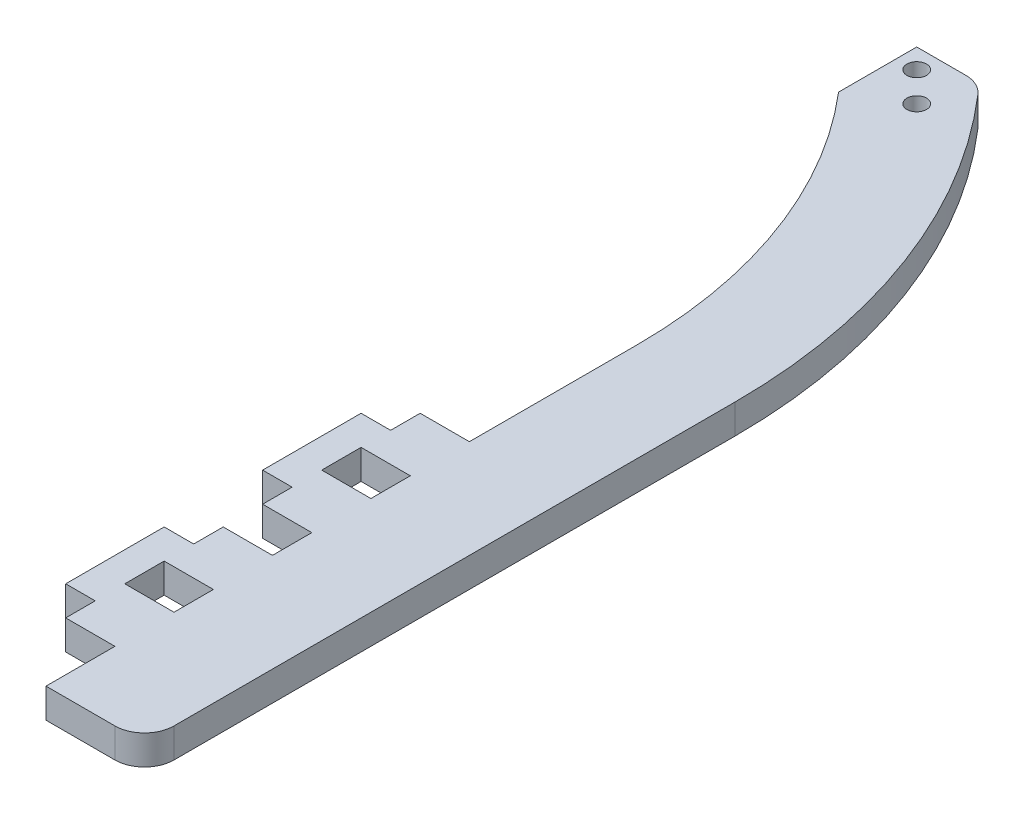
ISO-10303-21;
HEADER;
FILE_DESCRIPTION(('STEP AP214'),'2;1');
FILE_NAME('part.step','',(''),(''),'','','');
FILE_SCHEMA(('AUTOMOTIVE_DESIGN { 1 0 10303 214 1 1 1 1 }'));
ENDSEC;
DATA;
#1=APPLICATION_CONTEXT('core data for automotive mechanical design processes');
#2=APPLICATION_PROTOCOL_DEFINITION('international standard','automotive_design',2000,#1);
#3=PRODUCT_CONTEXT('',#1,'mechanical');
#4=PRODUCT('Part','Part','',(#3));
#5=PRODUCT_RELATED_PRODUCT_CATEGORY('part','',(#4));
#6=PRODUCT_DEFINITION_FORMATION('','',#4);
#7=PRODUCT_DEFINITION_CONTEXT('part definition',#1,'design');
#8=PRODUCT_DEFINITION('design','',#6,#7);
#9=PRODUCT_DEFINITION_SHAPE('','',#8);
#10=(LENGTH_UNIT() NAMED_UNIT(*) SI_UNIT(.MILLI.,.METRE.));
#11=(NAMED_UNIT(*) PLANE_ANGLE_UNIT() SI_UNIT($,.RADIAN.));
#12=(NAMED_UNIT(*) SI_UNIT($,.STERADIAN.) SOLID_ANGLE_UNIT());
#13=UNCERTAINTY_MEASURE_WITH_UNIT(LENGTH_MEASURE(1.E-05),#10,'distance_accuracy_value','');
#14=(GEOMETRIC_REPRESENTATION_CONTEXT(3) GLOBAL_UNCERTAINTY_ASSIGNED_CONTEXT((#13)) GLOBAL_UNIT_ASSIGNED_CONTEXT((#10,
#11,#12)) REPRESENTATION_CONTEXT('',''));
#15=CARTESIAN_POINT('',(0.,0.,0.));
#16=DIRECTION('',(0.,0.,1.));
#17=DIRECTION('',(1.,0.,0.));
#18=AXIS2_PLACEMENT_3D('',#15,#16,#17);
#19=CARTESIAN_POINT('',(-5.66950299421733,-0.01,-40.4327470649756));
#20=DIRECTION('',(0.,0.,1.));
#21=DIRECTION('',(1.,0.,0.));
#22=AXIS2_PLACEMENT_3D('',#19,#20,#21);
#23=PLANE('',#22);
#24=DIRECTION('',(1.,0.,0.));
#25=VECTOR('',#24,1.);
#26=CARTESIAN_POINT('',(0.,3.,-40.4327470649756));
#27=LINE('',#26,#25);
#28=CARTESIAN_POINT('',(-12.,3.,-40.4327470649756));
#29=VERTEX_POINT('',#28);
#30=CARTESIAN_POINT('',(-7.01407850040248,3.,-40.4327470649756));
#31=VERTEX_POINT('',#30);
#32=EDGE_CURVE('E486',#29,#31,#27,.T.);
#33=ORIENTED_EDGE('',*,*,#32,.T.);
#34=DIRECTION('',(0.,-1.,0.));
#35=VECTOR('',#34,1.);
#36=CARTESIAN_POINT('',(-7.01407850040248,-0.01,-40.4327470649756));
#37=LINE('',#36,#35);
#38=CARTESIAN_POINT('',(-7.01407850040248,0.,-40.4327470649756));
#39=VERTEX_POINT('',#38);
#40=EDGE_CURVE('E498',#31,#39,#37,.T.);
#41=ORIENTED_EDGE('',*,*,#40,.T.);
#42=DIRECTION('',(1.,0.,0.));
#43=VECTOR('',#42,1.);
#44=CARTESIAN_POINT('',(0.,0.,-40.4327470649756));
#45=LINE('',#44,#43);
#46=CARTESIAN_POINT('',(-12.,0.,-40.4327470649756));
#47=VERTEX_POINT('',#46);
#48=EDGE_CURVE('E485',#47,#39,#45,.T.);
#49=ORIENTED_EDGE('',*,*,#48,.F.);
#50=DIRECTION('',(0.,-1.,0.));
#51=VECTOR('',#50,1.);
#52=CARTESIAN_POINT('',(-12.,-0.01,-40.4327470649756));
#53=LINE('',#52,#51);
#54=EDGE_CURVE('E490',#29,#47,#53,.T.);
#55=ORIENTED_EDGE('',*,*,#54,.F.);
#56=EDGE_LOOP('',(#33,#41,#49,#55));
#57=FACE_BOUND('',#56,.T.);
#58=ADVANCED_FACE('F36',(#57),#23,.F.);
#59=CARTESIAN_POINT('',(0.,3.,0.));
#60=DIRECTION('',(1.,0.,0.));
#61=DIRECTION('',(0.,0.,-1.));
#62=AXIS2_PLACEMENT_3D('',#59,#60,#61);
#63=PLANE('',#62);
#64=DIRECTION('',(0.,0.,1.));
#65=VECTOR('',#64,1.);
#66=CARTESIAN_POINT('',(0.,0.,0.));
#67=LINE('',#66,#65);
#68=CARTESIAN_POINT('',(0.,0.,0.));
#69=VERTEX_POINT('',#68);
#70=CARTESIAN_POINT('',(0.,0.,17.));
#71=VERTEX_POINT('',#70);
#72=EDGE_CURVE('E448',#69,#71,#67,.T.);
#73=ORIENTED_EDGE('',*,*,#72,.T.);
#74=DIRECTION('',(0.,1.,0.));
#75=VECTOR('',#74,1.);
#76=CARTESIAN_POINT('',(0.,3.,17.));
#77=LINE('',#76,#75);
#78=CARTESIAN_POINT('',(0.,3.,17.));
#79=VERTEX_POINT('',#78);
#80=EDGE_CURVE('E342',#71,#79,#77,.T.);
#81=ORIENTED_EDGE('',*,*,#80,.T.);
#82=DIRECTION('',(0.,0.,1.));
#83=VECTOR('',#82,1.);
#84=CARTESIAN_POINT('',(0.,3.,0.));
#85=LINE('',#84,#83);
#86=CARTESIAN_POINT('',(0.,3.,0.));
#87=VERTEX_POINT('',#86);
#88=EDGE_CURVE('E432',#87,#79,#85,.T.);
#89=ORIENTED_EDGE('',*,*,#88,.F.);
#90=DIRECTION('',(0.,-1.,0.));
#91=VECTOR('',#90,1.);
#92=CARTESIAN_POINT('',(0.,3.,0.));
#93=LINE('',#92,#91);
#94=EDGE_CURVE('E467',#87,#69,#93,.T.);
#95=ORIENTED_EDGE('',*,*,#94,.T.);
#96=EDGE_LOOP('',(#73,#81,#89,#95));
#97=FACE_BOUND('',#96,.T.);
#98=ADVANCED_FACE('F546',(#97),#63,.F.);
#99=CARTESIAN_POINT('',(0.,3.,53.));
#100=VERTEX_POINT('',#99);
#101=CARTESIAN_POINT('',(0.,3.,60.));
#102=VERTEX_POINT('',#101);
#103=EDGE_CURVE('E430',#100,#102,#85,.T.);
#104=ORIENTED_EDGE('',*,*,#103,.F.);
#105=DIRECTION('',(0.,-1.,0.));
#106=VECTOR('',#105,1.);
#107=CARTESIAN_POINT('',(0.,3.,53.));
#108=LINE('',#107,#106);
#109=CARTESIAN_POINT('',(0.,0.,53.));
#110=VERTEX_POINT('',#109);
#111=EDGE_CURVE('E357',#100,#110,#108,.T.);
#112=ORIENTED_EDGE('',*,*,#111,.T.);
#113=CARTESIAN_POINT('',(0.,0.,60.));
#114=VERTEX_POINT('',#113);
#115=EDGE_CURVE('E447',#110,#114,#67,.T.);
#116=ORIENTED_EDGE('',*,*,#115,.T.);
#117=DIRECTION('',(0.,-1.,0.));
#118=VECTOR('',#117,1.);
#119=CARTESIAN_POINT('',(0.,3.,60.));
#120=LINE('',#119,#118);
#121=EDGE_CURVE('E461',#102,#114,#120,.T.);
#122=ORIENTED_EDGE('',*,*,#121,.F.);
#123=EDGE_LOOP('',(#104,#112,#116,#122));
#124=FACE_BOUND('',#123,.T.);
#125=ADVANCED_FACE('F585',(#124),#63,.F.);
#126=CARTESIAN_POINT('',(-12.,-0.01,-32.4961536185439));
#127=DIRECTION('',(1.,0.,0.));
#128=DIRECTION('',(0.,0.,-1.));
#129=AXIS2_PLACEMENT_3D('',#126,#127,#128);
#130=PLANE('',#129);
#131=DIRECTION('',(0.,0.,-1.));
#132=VECTOR('',#131,1.);
#133=CARTESIAN_POINT('',(-12.,3.,0.));
#134=LINE('',#133,#132);
#135=CARTESIAN_POINT('',(-12.,3.,-32.4961536185439));
#136=VERTEX_POINT('',#135);
#137=EDGE_CURVE('E468',#136,#29,#134,.T.);
#138=ORIENTED_EDGE('',*,*,#137,.T.);
#139=ORIENTED_EDGE('',*,*,#54,.T.);
#140=DIRECTION('',(0.,0.,-1.));
#141=VECTOR('',#140,1.);
#142=CARTESIAN_POINT('',(-12.,0.,0.));
#143=LINE('',#142,#141);
#144=CARTESIAN_POINT('',(-12.,0.,-32.4961536185439));
#145=VERTEX_POINT('',#144);
#146=EDGE_CURVE('E464',#145,#47,#143,.T.);
#147=ORIENTED_EDGE('',*,*,#146,.F.);
#148=DIRECTION('',(0.,-1.,0.));
#149=VECTOR('',#148,1.);
#150=CARTESIAN_POINT('',(-12.,3.,-32.4961536185439));
#151=LINE('',#150,#149);
#152=EDGE_CURVE('E472',#145,#136,#151,.F.);
#153=ORIENTED_EDGE('',*,*,#152,.T.);
#154=EDGE_LOOP('',(#138,#139,#147,#153));
#155=FACE_BOUND('',#154,.T.);
#156=ADVANCED_FACE('F557',(#155),#130,.F.);
#157=CARTESIAN_POINT('',(0.,3.,60.));
#158=DIRECTION('',(0.,0.,-1.));
#159=DIRECTION('',(-1.,0.,0.));
#160=AXIS2_PLACEMENT_3D('',#157,#158,#159);
#161=PLANE('',#160);
#162=DIRECTION('',(1.,0.,0.));
#163=VECTOR('',#162,1.);
#164=CARTESIAN_POINT('',(0.,0.,60.));
#165=LINE('',#164,#163);
#166=CARTESIAN_POINT('',(7.00000000000001,0.,60.));
#167=VERTEX_POINT('',#166);
#168=EDGE_CURVE('E451',#114,#167,#165,.T.);
#169=ORIENTED_EDGE('',*,*,#168,.T.);
#170=DIRECTION('',(0.,-1.,0.));
#171=VECTOR('',#170,1.);
#172=CARTESIAN_POINT('',(7.00000000000001,3.,60.));
#173=LINE('',#172,#171);
#174=CARTESIAN_POINT('',(7.00000000000001,3.,60.));
#175=VERTEX_POINT('',#174);
#176=EDGE_CURVE('E481',#167,#175,#173,.F.);
#177=ORIENTED_EDGE('',*,*,#176,.T.);
#178=DIRECTION('',(1.,0.,0.));
#179=VECTOR('',#178,1.);
#180=CARTESIAN_POINT('',(0.,3.,60.));
#181=LINE('',#180,#179);
#182=EDGE_CURVE('E435',#102,#175,#181,.T.);
#183=ORIENTED_EDGE('',*,*,#182,.F.);
#184=ORIENTED_EDGE('',*,*,#121,.T.);
#185=EDGE_LOOP('',(#169,#177,#183,#184));
#186=FACE_BOUND('',#185,.T.);
#187=ADVANCED_FACE('F577',(#186),#161,.F.);
#188=CARTESIAN_POINT('',(10.,3.,0.));
#189=DIRECTION('',(-1.,0.,0.));
#190=DIRECTION('',(0.,0.,1.));
#191=AXIS2_PLACEMENT_3D('',#188,#189,#190);
#192=PLANE('',#191);
#193=DIRECTION('',(0.,0.,-1.));
#194=VECTOR('',#193,1.);
#195=CARTESIAN_POINT('',(10.,3.,0.));
#196=LINE('',#195,#194);
#197=CARTESIAN_POINT('',(10.,3.,57.));
#198=VERTEX_POINT('',#197);
#199=CARTESIAN_POINT('',(10.,3.,0.));
#200=VERTEX_POINT('',#199);
#201=EDGE_CURVE('E439',#198,#200,#196,.T.);
#202=ORIENTED_EDGE('',*,*,#201,.F.);
#203=DIRECTION('',(0.,-1.,0.));
#204=VECTOR('',#203,1.);
#205=CARTESIAN_POINT('',(10.,3.,57.));
#206=LINE('',#205,#204);
#207=CARTESIAN_POINT('',(10.,0.,57.));
#208=VERTEX_POINT('',#207);
#209=EDGE_CURVE('E471',#198,#208,#206,.T.);
#210=ORIENTED_EDGE('',*,*,#209,.T.);
#211=DIRECTION('',(0.,0.,-1.));
#212=VECTOR('',#211,1.);
#213=CARTESIAN_POINT('',(10.,0.,0.));
#214=LINE('',#213,#212);
#215=CARTESIAN_POINT('',(10.,0.,0.));
#216=VERTEX_POINT('',#215);
#217=EDGE_CURVE('E455',#208,#216,#214,.T.);
#218=ORIENTED_EDGE('',*,*,#217,.T.);
#219=DIRECTION('',(0.,-1.,0.));
#220=VECTOR('',#219,1.);
#221=CARTESIAN_POINT('',(10.,3.,0.));
#222=LINE('',#221,#220);
#223=EDGE_CURVE('E444',#200,#216,#222,.T.);
#224=ORIENTED_EDGE('',*,*,#223,.F.);
#225=EDGE_LOOP('',(#202,#210,#218,#224));
#226=FACE_BOUND('',#225,.T.);
#227=ADVANCED_FACE('F570',(#226),#192,.F.);
#228=CARTESIAN_POINT('',(-50.,3.,0.));
#229=DIRECTION('',(0.,-1.,0.));
#230=DIRECTION('',(0.,0.,-1.));
#231=AXIS2_PLACEMENT_3D('',#228,#229,#230);
#232=CYLINDRICAL_SURFACE('',#231,60.);
#233=CARTESIAN_POINT('',(-50.,0.,0.));
#234=DIRECTION('',(0.,1.,0.));
#235=DIRECTION('',(0.,0.,1.));
#236=AXIS2_PLACEMENT_3D('',#233,#234,#235);
#237=CIRCLE('',#236,60.);
#238=CARTESIAN_POINT('',(-4.75166157937103,0.,-39.4028916473427));
#239=VERTEX_POINT('',#238);
#240=EDGE_CURVE('E424',#216,#239,#237,.T.);
#241=ORIENTED_EDGE('',*,*,#240,.T.);
#242=DIRECTION('',(0.,-1.,0.));
#243=VECTOR('',#242,1.);
#244=CARTESIAN_POINT('',(-4.75166157937103,3.,-39.4028916473428));
#245=LINE('',#244,#243);
#246=CARTESIAN_POINT('',(-4.75166157937103,3.,-39.4028916473427));
#247=VERTEX_POINT('',#246);
#248=EDGE_CURVE('E489',#239,#247,#245,.F.);
#249=ORIENTED_EDGE('',*,*,#248,.T.);
#250=CARTESIAN_POINT('',(-50.,3.,0.));
#251=DIRECTION('',(0.,1.,0.));
#252=DIRECTION('',(0.,0.,1.));
#253=AXIS2_PLACEMENT_3D('',#250,#251,#252);
#254=CIRCLE('',#253,60.);
#255=EDGE_CURVE('E427',#200,#247,#254,.T.);
#256=ORIENTED_EDGE('',*,*,#255,.F.);
#257=ORIENTED_EDGE('',*,*,#223,.T.);
#258=EDGE_LOOP('',(#241,#249,#256,#257));
#259=FACE_BOUND('',#258,.T.);
#260=ADVANCED_FACE('F565',(#259),#232,.T.);
#261=CARTESIAN_POINT('',(-50.,3.,0.));
#262=DIRECTION('',(0.,-1.,0.));
#263=DIRECTION('',(0.,0.,-1.));
#264=AXIS2_PLACEMENT_3D('',#261,#262,#263);
#265=CYLINDRICAL_SURFACE('',#264,50.);
#266=ORIENTED_EDGE('',*,*,#94,.F.);
#267=CARTESIAN_POINT('',(-50.,3.,0.));
#268=DIRECTION('',(0.,1.,0.));
#269=DIRECTION('',(0.,0.,1.));
#270=AXIS2_PLACEMENT_3D('',#267,#268,#269);
#271=CIRCLE('',#270,50.);
#272=EDGE_CURVE('E441',#87,#136,#271,.T.);
#273=ORIENTED_EDGE('',*,*,#272,.T.);
#274=ORIENTED_EDGE('',*,*,#152,.F.);
#275=CARTESIAN_POINT('',(-50.,0.,0.));
#276=DIRECTION('',(0.,1.,0.));
#277=DIRECTION('',(0.,0.,1.));
#278=AXIS2_PLACEMENT_3D('',#275,#276,#277);
#279=CIRCLE('',#278,50.);
#280=EDGE_CURVE('E431',#69,#145,#279,.T.);
#281=ORIENTED_EDGE('',*,*,#280,.F.);
#282=EDGE_LOOP('',(#266,#273,#274,#281));
#283=FACE_BOUND('',#282,.T.);
#284=ADVANCED_FACE('F551',(#283),#265,.F.);
#285=CARTESIAN_POINT('',(0.,0.,0.));
#286=DIRECTION('',(0.,1.,0.));
#287=DIRECTION('',(0.,0.,1.));
#288=AXIS2_PLACEMENT_3D('',#285,#286,#287);
#289=PLANE('',#288);
#290=DIRECTION('',(1.,0.,0.));
#291=VECTOR('',#290,1.);
#292=CARTESIAN_POINT('',(0.,0.,47.));
#293=LINE('',#292,#291);
#294=CARTESIAN_POINT('',(-5.,0.,47.));
#295=VERTEX_POINT('',#294);
#296=CARTESIAN_POINT('',(0.,0.,47.));
#297=VERTEX_POINT('',#296);
#298=EDGE_CURVE('E259',#295,#297,#293,.T.);
#299=ORIENTED_EDGE('',*,*,#298,.T.);
#300=DIRECTION('',(0.,0.,-1.));
#301=VECTOR('',#300,1.);
#302=CARTESIAN_POINT('',(0.,0.,47.));
#303=LINE('',#302,#301);
#304=CARTESIAN_POINT('',(0.,0.,43.));
#305=VERTEX_POINT('',#304);
#306=EDGE_CURVE('E253',#297,#305,#303,.T.);
#307=ORIENTED_EDGE('',*,*,#306,.T.);
#308=DIRECTION('',(-1.,0.,0.));
#309=VECTOR('',#308,1.);
#310=CARTESIAN_POINT('',(0.,0.,43.));
#311=LINE('',#310,#309);
#312=CARTESIAN_POINT('',(-5.,0.,43.));
#313=VERTEX_POINT('',#312);
#314=EDGE_CURVE('E262',#305,#313,#311,.T.);
#315=ORIENTED_EDGE('',*,*,#314,.T.);
#316=DIRECTION('',(0.,0.,1.));
#317=VECTOR('',#316,1.);
#318=CARTESIAN_POINT('',(-5.,0.,47.));
#319=LINE('',#318,#317);
#320=EDGE_CURVE('E51',#313,#295,#319,.T.);
#321=ORIENTED_EDGE('',*,*,#320,.T.);
#322=EDGE_LOOP('',(#299,#307,#315,#321));
#323=FACE_BOUND('',#322,.T.);
#324=DIRECTION('',(1.,0.,0.));
#325=VECTOR('',#324,1.);
#326=CARTESIAN_POINT('',(0.,0.,27.));
#327=LINE('',#326,#325);
#328=CARTESIAN_POINT('',(-5.,0.,27.));
#329=VERTEX_POINT('',#328);
#330=CARTESIAN_POINT('',(0.,0.,27.));
#331=VERTEX_POINT('',#330);
#332=EDGE_CURVE('E298',#329,#331,#327,.T.);
#333=ORIENTED_EDGE('',*,*,#332,.T.);
#334=DIRECTION('',(0.,0.,-1.));
#335=VECTOR('',#334,1.);
#336=CARTESIAN_POINT('',(0.,0.,23.));
#337=LINE('',#336,#335);
#338=CARTESIAN_POINT('',(0.,0.,23.));
#339=VERTEX_POINT('',#338);
#340=EDGE_CURVE('E288',#331,#339,#337,.T.);
#341=ORIENTED_EDGE('',*,*,#340,.T.);
#342=DIRECTION('',(-1.,0.,0.));
#343=VECTOR('',#342,1.);
#344=CARTESIAN_POINT('',(0.,0.,23.));
#345=LINE('',#344,#343);
#346=CARTESIAN_POINT('',(-5.,0.,23.));
#347=VERTEX_POINT('',#346);
#348=EDGE_CURVE('E291',#339,#347,#345,.T.);
#349=ORIENTED_EDGE('',*,*,#348,.T.);
#350=DIRECTION('',(0.,0.,1.));
#351=VECTOR('',#350,1.);
#352=CARTESIAN_POINT('',(-5.,0.,23.));
#353=LINE('',#352,#351);
#354=EDGE_CURVE('E295',#347,#329,#353,.T.);
#355=ORIENTED_EDGE('',*,*,#354,.T.);
#356=EDGE_LOOP('',(#333,#341,#349,#355));
#357=FACE_BOUND('',#356,.T.);
#358=DIRECTION('',(0.,0.,1.));
#359=VECTOR('',#358,1.);
#360=CARTESIAN_POINT('',(-4.99999999999999,0.,33.));
#361=LINE('',#360,#359);
#362=CARTESIAN_POINT('',(-4.99999999999999,0.,30.));
#363=VERTEX_POINT('',#362);
#364=CARTESIAN_POINT('',(-4.99999999999999,0.,33.));
#365=VERTEX_POINT('',#364);
#366=EDGE_CURVE('E322',#363,#365,#361,.T.);
#367=ORIENTED_EDGE('',*,*,#366,.F.);
#368=DIRECTION('',(1.,0.,0.));
#369=VECTOR('',#368,1.);
#370=CARTESIAN_POINT('',(-7.99999999999999,0.,30.));
#371=LINE('',#370,#369);
#372=CARTESIAN_POINT('',(-7.99999999999999,0.,30.));
#373=VERTEX_POINT('',#372);
#374=EDGE_CURVE('E390',#373,#363,#371,.T.);
#375=ORIENTED_EDGE('',*,*,#374,.F.);
#376=DIRECTION('',(0.,0.,1.));
#377=VECTOR('',#376,1.);
#378=CARTESIAN_POINT('',(-7.99999999999999,0.,20.));
#379=LINE('',#378,#377);
#380=CARTESIAN_POINT('',(-7.99999999999999,0.,20.));
#381=VERTEX_POINT('',#380);
#382=EDGE_CURVE('E386',#381,#373,#379,.T.);
#383=ORIENTED_EDGE('',*,*,#382,.F.);
#384=DIRECTION('',(-1.,0.,0.));
#385=VECTOR('',#384,1.);
#386=CARTESIAN_POINT('',(0.,0.,20.));
#387=LINE('',#386,#385);
#388=CARTESIAN_POINT('',(-4.99999999999999,0.,20.));
#389=VERTEX_POINT('',#388);
#390=EDGE_CURVE('E384',#389,#381,#387,.T.);
#391=ORIENTED_EDGE('',*,*,#390,.F.);
#392=DIRECTION('',(0.,0.,1.));
#393=VECTOR('',#392,1.);
#394=CARTESIAN_POINT('',(-4.99999999999999,0.,22.));
#395=LINE('',#394,#393);
#396=CARTESIAN_POINT('',(-4.99999999999999,0.,17.));
#397=VERTEX_POINT('',#396);
#398=EDGE_CURVE('E334',#397,#389,#395,.T.);
#399=ORIENTED_EDGE('',*,*,#398,.F.);
#400=DIRECTION('',(-1.,0.,0.));
#401=VECTOR('',#400,1.);
#402=CARTESIAN_POINT('',(-4.99999999999999,0.,17.));
#403=LINE('',#402,#401);
#404=EDGE_CURVE('E332',#71,#397,#403,.T.);
#405=ORIENTED_EDGE('',*,*,#404,.F.);
#406=ORIENTED_EDGE('',*,*,#72,.F.);
#407=ORIENTED_EDGE('',*,*,#280,.T.);
#408=ORIENTED_EDGE('',*,*,#146,.T.);
#409=ORIENTED_EDGE('',*,*,#48,.T.);
#410=CARTESIAN_POINT('',(-7.01407850040248,0.,-37.4327470649756));
#411=DIRECTION('',(0.,1.,0.));
#412=DIRECTION('',(0.,0.,1.));
#413=AXIS2_PLACEMENT_3D('',#410,#411,#412);
#414=CIRCLE('',#413,3.);
#415=EDGE_CURVE('E500',#39,#239,#414,.F.);
#416=ORIENTED_EDGE('',*,*,#415,.T.);
#417=ORIENTED_EDGE('',*,*,#240,.F.);
#418=ORIENTED_EDGE('',*,*,#217,.F.);
#419=CARTESIAN_POINT('',(7.00000000000001,0.,57.));
#420=DIRECTION('',(0.,1.,0.));
#421=DIRECTION('',(0.,0.,1.));
#422=AXIS2_PLACEMENT_3D('',#419,#420,#421);
#423=CIRCLE('',#422,3.);
#424=EDGE_CURVE('E479',#208,#167,#423,.F.);
#425=ORIENTED_EDGE('',*,*,#424,.T.);
#426=ORIENTED_EDGE('',*,*,#168,.F.);
#427=ORIENTED_EDGE('',*,*,#115,.F.);
#428=DIRECTION('',(1.,0.,0.));
#429=VECTOR('',#428,1.);
#430=CARTESIAN_POINT('',(-4.99999999999999,0.,53.));
#431=LINE('',#430,#429);
#432=CARTESIAN_POINT('',(-4.99999999999999,0.,53.));
#433=VERTEX_POINT('',#432);
#434=EDGE_CURVE('E348',#433,#110,#431,.T.);
#435=ORIENTED_EDGE('',*,*,#434,.F.);
#436=DIRECTION('',(0.,0.,1.));
#437=VECTOR('',#436,1.);
#438=CARTESIAN_POINT('',(-4.99999999999999,0.,48.));
#439=LINE('',#438,#437);
#440=CARTESIAN_POINT('',(-4.99999999999999,0.,50.));
#441=VERTEX_POINT('',#440);
#442=EDGE_CURVE('E346',#441,#433,#439,.T.);
#443=ORIENTED_EDGE('',*,*,#442,.F.);
#444=DIRECTION('',(1.,0.,0.));
#445=VECTOR('',#444,1.);
#446=CARTESIAN_POINT('',(3.00000000000002,0.,50.));
#447=LINE('',#446,#445);
#448=CARTESIAN_POINT('',(-7.99999999999999,0.,50.));
#449=VERTEX_POINT('',#448);
#450=EDGE_CURVE('E406',#449,#441,#447,.T.);
#451=ORIENTED_EDGE('',*,*,#450,.F.);
#452=DIRECTION('',(0.,0.,1.));
#453=VECTOR('',#452,1.);
#454=CARTESIAN_POINT('',(-7.99999999999999,0.,50.));
#455=LINE('',#454,#453);
#456=CARTESIAN_POINT('',(-7.99999999999999,0.,40.));
#457=VERTEX_POINT('',#456);
#458=EDGE_CURVE('E412',#457,#449,#455,.T.);
#459=ORIENTED_EDGE('',*,*,#458,.F.);
#460=DIRECTION('',(-1.,0.,0.));
#461=VECTOR('',#460,1.);
#462=CARTESIAN_POINT('',(0.,0.,40.));
#463=LINE('',#462,#461);
#464=CARTESIAN_POINT('',(-4.99999999999999,0.,40.));
#465=VERTEX_POINT('',#464);
#466=EDGE_CURVE('E409',#465,#457,#463,.T.);
#467=ORIENTED_EDGE('',*,*,#466,.F.);
#468=DIRECTION('',(0.,0.,1.));
#469=VECTOR('',#468,1.);
#470=CARTESIAN_POINT('',(-4.99999999999999,0.,37.));
#471=LINE('',#470,#469);
#472=CARTESIAN_POINT('',(-4.99999999999999,0.,37.));
#473=VERTEX_POINT('',#472);
#474=EDGE_CURVE('E361',#473,#465,#471,.T.);
#475=ORIENTED_EDGE('',*,*,#474,.F.);
#476=DIRECTION('',(-1.,0.,0.));
#477=VECTOR('',#476,1.);
#478=CARTESIAN_POINT('',(-4.99999999999999,0.,37.));
#479=LINE('',#478,#477);
#480=CARTESIAN_POINT('',(0.,0.,37.));
#481=VERTEX_POINT('',#480);
#482=EDGE_CURVE('E363',#481,#473,#479,.T.);
#483=ORIENTED_EDGE('',*,*,#482,.F.);
#484=CARTESIAN_POINT('',(0.,0.,33.));
#485=VERTEX_POINT('',#484);
#486=EDGE_CURVE('E452',#485,#481,#67,.T.);
#487=ORIENTED_EDGE('',*,*,#486,.F.);
#488=DIRECTION('',(1.,0.,0.));
#489=VECTOR('',#488,1.);
#490=CARTESIAN_POINT('',(-4.99999999999999,0.,33.));
#491=LINE('',#490,#489);
#492=EDGE_CURVE('E320',#365,#485,#491,.T.);
#493=ORIENTED_EDGE('',*,*,#492,.F.);
#494=EDGE_LOOP('',(#367,#375,#383,#391,#399,#405,#406,#407,#408,#409,#416,#417,#418,#425,#426,
#427,#435,#443,#451,#459,#467,#475,#483,#487,#493));
#495=FACE_BOUND('',#494,.T.);
#496=CARTESIAN_POINT('',(-7.,0.,-35.4327470649756));
#497=DIRECTION('',(0.,1.,0.));
#498=DIRECTION('',(0.,0.,1.));
#499=AXIS2_PLACEMENT_3D('',#496,#497,#498);
#500=CIRCLE('',#499,1.);
#501=CARTESIAN_POINT('',(-7.,0.,-34.4327470649756));
#502=VERTEX_POINT('',#501);
#503=EDGE_CURVE('E372',#502,#502,#500,.T.);
#504=ORIENTED_EDGE('',*,*,#503,.T.);
#505=EDGE_LOOP('',(#504));
#506=FACE_BOUND('',#505,.T.);
#507=CARTESIAN_POINT('',(-10.,0.,-38.4327470649756));
#508=DIRECTION('',(0.,1.,0.));
#509=DIRECTION('',(0.,0.,1.));
#510=AXIS2_PLACEMENT_3D('',#507,#508,#509);
#511=CIRCLE('',#510,1.);
#512=CARTESIAN_POINT('',(-10.,0.,-37.4327470649756));
#513=VERTEX_POINT('',#512);
#514=EDGE_CURVE('E378',#513,#513,#511,.T.);
#515=ORIENTED_EDGE('',*,*,#514,.T.);
#516=EDGE_LOOP('',(#515));
#517=FACE_BOUND('',#516,.T.);
#518=ADVANCED_FACE('F266',(#323,#357,#495,#506,#517),#289,.F.);
#519=CARTESIAN_POINT('',(0.,3.,0.));
#520=DIRECTION('',(0.,1.,0.));
#521=DIRECTION('',(0.,0.,1.));
#522=AXIS2_PLACEMENT_3D('',#519,#520,#521);
#523=PLANE('',#522);
#524=DIRECTION('',(0.,0.,-1.));
#525=VECTOR('',#524,1.);
#526=CARTESIAN_POINT('',(0.,3.,47.));
#527=LINE('',#526,#525);
#528=CARTESIAN_POINT('',(0.,3.,47.));
#529=VERTEX_POINT('',#528);
#530=CARTESIAN_POINT('',(0.,3.,43.));
#531=VERTEX_POINT('',#530);
#532=EDGE_CURVE('E59',#529,#531,#527,.T.);
#533=ORIENTED_EDGE('',*,*,#532,.F.);
#534=DIRECTION('',(1.,0.,0.));
#535=VECTOR('',#534,1.);
#536=CARTESIAN_POINT('',(0.,3.,47.));
#537=LINE('',#536,#535);
#538=CARTESIAN_POINT('',(-5.,3.,47.));
#539=VERTEX_POINT('',#538);
#540=EDGE_CURVE('E269',#539,#529,#537,.T.);
#541=ORIENTED_EDGE('',*,*,#540,.F.);
#542=DIRECTION('',(0.,0.,1.));
#543=VECTOR('',#542,1.);
#544=CARTESIAN_POINT('',(-5.,3.,47.));
#545=LINE('',#544,#543);
#546=CARTESIAN_POINT('',(-5.,3.,43.));
#547=VERTEX_POINT('',#546);
#548=EDGE_CURVE('E272',#547,#539,#545,.T.);
#549=ORIENTED_EDGE('',*,*,#548,.F.);
#550=DIRECTION('',(-1.,0.,0.));
#551=VECTOR('',#550,1.);
#552=CARTESIAN_POINT('',(0.,3.,43.));
#553=LINE('',#552,#551);
#554=EDGE_CURVE('E278',#531,#547,#553,.T.);
#555=ORIENTED_EDGE('',*,*,#554,.F.);
#556=EDGE_LOOP('',(#533,#541,#549,#555));
#557=FACE_BOUND('',#556,.T.);
#558=DIRECTION('',(0.,0.,-1.));
#559=VECTOR('',#558,1.);
#560=CARTESIAN_POINT('',(0.,3.,23.));
#561=LINE('',#560,#559);
#562=CARTESIAN_POINT('',(0.,3.,27.));
#563=VERTEX_POINT('',#562);
#564=CARTESIAN_POINT('',(0.,3.,23.));
#565=VERTEX_POINT('',#564);
#566=EDGE_CURVE('E284',#563,#565,#561,.T.);
#567=ORIENTED_EDGE('',*,*,#566,.F.);
#568=DIRECTION('',(1.,0.,0.));
#569=VECTOR('',#568,1.);
#570=CARTESIAN_POINT('',(0.,3.,27.));
#571=LINE('',#570,#569);
#572=CARTESIAN_POINT('',(-5.,3.,27.));
#573=VERTEX_POINT('',#572);
#574=EDGE_CURVE('E292',#573,#563,#571,.T.);
#575=ORIENTED_EDGE('',*,*,#574,.F.);
#576=DIRECTION('',(0.,0.,1.));
#577=VECTOR('',#576,1.);
#578=CARTESIAN_POINT('',(-5.,3.,23.));
#579=LINE('',#578,#577);
#580=CARTESIAN_POINT('',(-5.,3.,23.));
#581=VERTEX_POINT('',#580);
#582=EDGE_CURVE('E306',#581,#573,#579,.T.);
#583=ORIENTED_EDGE('',*,*,#582,.F.);
#584=DIRECTION('',(-1.,0.,0.));
#585=VECTOR('',#584,1.);
#586=CARTESIAN_POINT('',(0.,3.,23.));
#587=LINE('',#586,#585);
#588=EDGE_CURVE('E303',#565,#581,#587,.T.);
#589=ORIENTED_EDGE('',*,*,#588,.F.);
#590=EDGE_LOOP('',(#567,#575,#583,#589));
#591=FACE_BOUND('',#590,.T.);
#592=DIRECTION('',(1.,0.,0.));
#593=VECTOR('',#592,1.);
#594=CARTESIAN_POINT('',(0.,3.,30.));
#595=LINE('',#594,#593);
#596=CARTESIAN_POINT('',(-7.99999999999999,3.,30.));
#597=VERTEX_POINT('',#596);
#598=CARTESIAN_POINT('',(-4.99999999999999,3.,30.));
#599=VERTEX_POINT('',#598);
#600=EDGE_CURVE('E396',#597,#599,#595,.T.);
#601=ORIENTED_EDGE('',*,*,#600,.T.);
#602=DIRECTION('',(0.,0.,1.));
#603=VECTOR('',#602,1.);
#604=CARTESIAN_POINT('',(-4.99999999999999,3.,33.));
#605=LINE('',#604,#603);
#606=CARTESIAN_POINT('',(-4.99999999999999,3.,33.));
#607=VERTEX_POINT('',#606);
#608=EDGE_CURVE('E323',#599,#607,#605,.T.);
#609=ORIENTED_EDGE('',*,*,#608,.T.);
#610=DIRECTION('',(1.,0.,0.));
#611=VECTOR('',#610,1.);
#612=CARTESIAN_POINT('',(-4.99999999999999,3.,33.));
#613=LINE('',#612,#611);
#614=CARTESIAN_POINT('',(0.,3.,33.));
#615=VERTEX_POINT('',#614);
#616=EDGE_CURVE('E313',#607,#615,#613,.T.);
#617=ORIENTED_EDGE('',*,*,#616,.T.);
#618=CARTESIAN_POINT('',(0.,3.,37.));
#619=VERTEX_POINT('',#618);
#620=EDGE_CURVE('E436',#615,#619,#85,.T.);
#621=ORIENTED_EDGE('',*,*,#620,.T.);
#622=DIRECTION('',(-1.,0.,0.));
#623=VECTOR('',#622,1.);
#624=CARTESIAN_POINT('',(-4.99999999999999,3.,37.));
#625=LINE('',#624,#623);
#626=CARTESIAN_POINT('',(-4.99999999999999,3.,37.));
#627=VERTEX_POINT('',#626);
#628=EDGE_CURVE('E364',#619,#627,#625,.T.);
#629=ORIENTED_EDGE('',*,*,#628,.T.);
#630=DIRECTION('',(0.,0.,1.));
#631=VECTOR('',#630,1.);
#632=CARTESIAN_POINT('',(-4.99999999999999,3.,37.));
#633=LINE('',#632,#631);
#634=CARTESIAN_POINT('',(-4.99999999999999,3.,40.));
#635=VERTEX_POINT('',#634);
#636=EDGE_CURVE('E360',#627,#635,#633,.T.);
#637=ORIENTED_EDGE('',*,*,#636,.T.);
#638=DIRECTION('',(-1.,0.,0.));
#639=VECTOR('',#638,1.);
#640=CARTESIAN_POINT('',(-7.99999999999999,3.,40.));
#641=LINE('',#640,#639);
#642=CARTESIAN_POINT('',(-7.99999999999999,3.,40.));
#643=VERTEX_POINT('',#642);
#644=EDGE_CURVE('E403',#635,#643,#641,.T.);
#645=ORIENTED_EDGE('',*,*,#644,.T.);
#646=DIRECTION('',(0.,0.,1.));
#647=VECTOR('',#646,1.);
#648=CARTESIAN_POINT('',(-7.99999999999999,3.,50.));
#649=LINE('',#648,#647);
#650=CARTESIAN_POINT('',(-7.99999999999999,3.,50.));
#651=VERTEX_POINT('',#650);
#652=EDGE_CURVE('E417',#643,#651,#649,.T.);
#653=ORIENTED_EDGE('',*,*,#652,.T.);
#654=DIRECTION('',(1.,0.,0.));
#655=VECTOR('',#654,1.);
#656=CARTESIAN_POINT('',(0.,3.,50.));
#657=LINE('',#656,#655);
#658=CARTESIAN_POINT('',(-4.99999999999999,3.,50.));
#659=VERTEX_POINT('',#658);
#660=EDGE_CURVE('E410',#651,#659,#657,.T.);
#661=ORIENTED_EDGE('',*,*,#660,.T.);
#662=DIRECTION('',(0.,0.,1.));
#663=VECTOR('',#662,1.);
#664=CARTESIAN_POINT('',(-4.99999999999999,3.,48.));
#665=LINE('',#664,#663);
#666=CARTESIAN_POINT('',(-4.99999999999999,3.,53.));
#667=VERTEX_POINT('',#666);
#668=EDGE_CURVE('E345',#659,#667,#665,.T.);
#669=ORIENTED_EDGE('',*,*,#668,.T.);
#670=DIRECTION('',(1.,0.,0.));
#671=VECTOR('',#670,1.);
#672=CARTESIAN_POINT('',(-4.99999999999999,3.,53.));
#673=LINE('',#672,#671);
#674=EDGE_CURVE('E349',#667,#100,#673,.T.);
#675=ORIENTED_EDGE('',*,*,#674,.T.);
#676=ORIENTED_EDGE('',*,*,#103,.T.);
#677=ORIENTED_EDGE('',*,*,#182,.T.);
#678=CARTESIAN_POINT('',(7.00000000000001,3.,57.));
#679=DIRECTION('',(0.,1.,0.));
#680=DIRECTION('',(0.,0.,1.));
#681=AXIS2_PLACEMENT_3D('',#678,#679,#680);
#682=CIRCLE('',#681,3.);
#683=EDGE_CURVE('E483',#175,#198,#682,.T.);
#684=ORIENTED_EDGE('',*,*,#683,.T.);
#685=ORIENTED_EDGE('',*,*,#201,.T.);
#686=ORIENTED_EDGE('',*,*,#255,.T.);
#687=CARTESIAN_POINT('',(-7.01407850040248,3.,-37.4327470649756));
#688=DIRECTION('',(0.,1.,0.));
#689=DIRECTION('',(0.,0.,1.));
#690=AXIS2_PLACEMENT_3D('',#687,#688,#689);
#691=CIRCLE('',#690,3.);
#692=EDGE_CURVE('E496',#247,#31,#691,.T.);
#693=ORIENTED_EDGE('',*,*,#692,.T.);
#694=ORIENTED_EDGE('',*,*,#32,.F.);
#695=ORIENTED_EDGE('',*,*,#137,.F.);
#696=ORIENTED_EDGE('',*,*,#272,.F.);
#697=ORIENTED_EDGE('',*,*,#88,.T.);
#698=DIRECTION('',(-1.,0.,0.));
#699=VECTOR('',#698,1.);
#700=CARTESIAN_POINT('',(-4.99999999999999,3.,17.));
#701=LINE('',#700,#699);
#702=CARTESIAN_POINT('',(-4.99999999999999,3.,17.));
#703=VERTEX_POINT('',#702);
#704=EDGE_CURVE('E331',#79,#703,#701,.T.);
#705=ORIENTED_EDGE('',*,*,#704,.T.);
#706=DIRECTION('',(0.,0.,1.));
#707=VECTOR('',#706,1.);
#708=CARTESIAN_POINT('',(-4.99999999999999,3.,22.));
#709=LINE('',#708,#707);
#710=CARTESIAN_POINT('',(-4.99999999999999,3.,20.));
#711=VERTEX_POINT('',#710);
#712=EDGE_CURVE('E335',#703,#711,#709,.T.);
#713=ORIENTED_EDGE('',*,*,#712,.T.);
#714=DIRECTION('',(-1.,0.,0.));
#715=VECTOR('',#714,1.);
#716=CARTESIAN_POINT('',(3.00000000000002,3.,20.));
#717=LINE('',#716,#715);
#718=CARTESIAN_POINT('',(-7.99999999999999,3.,20.));
#719=VERTEX_POINT('',#718);
#720=EDGE_CURVE('E387',#711,#719,#717,.T.);
#721=ORIENTED_EDGE('',*,*,#720,.T.);
#722=DIRECTION('',(0.,0.,1.));
#723=VECTOR('',#722,1.);
#724=CARTESIAN_POINT('',(-7.99999999999999,3.,20.));
#725=LINE('',#724,#723);
#726=EDGE_CURVE('E381',#719,#597,#725,.T.);
#727=ORIENTED_EDGE('',*,*,#726,.T.);
#728=EDGE_LOOP('',(#601,#609,#617,#621,#629,#637,#645,#653,#661,#669,#675,#676,#677,#684,#685,
#686,#693,#694,#695,#696,#697,#705,#713,#721,#727));
#729=FACE_BOUND('',#728,.T.);
#730=CARTESIAN_POINT('',(-7.,3.,-35.4327470649756));
#731=DIRECTION('',(0.,1.,0.));
#732=DIRECTION('',(0.,0.,1.));
#733=AXIS2_PLACEMENT_3D('',#730,#731,#732);
#734=CIRCLE('',#733,1.);
#735=CARTESIAN_POINT('',(-7.,3.,-34.4327470649756));
#736=VERTEX_POINT('',#735);
#737=EDGE_CURVE('E371',#736,#736,#734,.T.);
#738=ORIENTED_EDGE('',*,*,#737,.F.);
#739=EDGE_LOOP('',(#738));
#740=FACE_BOUND('',#739,.T.);
#741=CARTESIAN_POINT('',(-10.,3.,-38.4327470649756));
#742=DIRECTION('',(0.,1.,0.));
#743=DIRECTION('',(0.,0.,1.));
#744=AXIS2_PLACEMENT_3D('',#741,#742,#743);
#745=CIRCLE('',#744,1.);
#746=CARTESIAN_POINT('',(-10.,3.,-37.4327470649756));
#747=VERTEX_POINT('',#746);
#748=EDGE_CURVE('E375',#747,#747,#745,.T.);
#749=ORIENTED_EDGE('',*,*,#748,.F.);
#750=EDGE_LOOP('',(#749));
#751=FACE_BOUND('',#750,.T.);
#752=ADVANCED_FACE('F530',(#557,#591,#729,#740,#751),#523,.T.);
#753=ORIENTED_EDGE('',*,*,#620,.F.);
#754=DIRECTION('',(0.,-1.,0.));
#755=VECTOR('',#754,1.);
#756=CARTESIAN_POINT('',(0.,3.,33.));
#757=LINE('',#756,#755);
#758=EDGE_CURVE('E11',#615,#485,#757,.T.);
#759=ORIENTED_EDGE('',*,*,#758,.T.);
#760=ORIENTED_EDGE('',*,*,#486,.T.);
#761=DIRECTION('',(0.,1.,0.));
#762=VECTOR('',#761,1.);
#763=CARTESIAN_POINT('',(0.,3.,37.));
#764=LINE('',#763,#762);
#765=EDGE_CURVE('E505',#481,#619,#764,.T.);
#766=ORIENTED_EDGE('',*,*,#765,.T.);
#767=EDGE_LOOP('',(#753,#759,#760,#766));
#768=FACE_BOUND('',#767,.T.);
#769=ADVANCED_FACE('F590',(#768),#63,.F.);
#770=CARTESIAN_POINT('',(7.00000000000001,3.,57.));
#771=DIRECTION('',(0.,-1.,0.));
#772=DIRECTION('',(0.,0.,-1.));
#773=AXIS2_PLACEMENT_3D('',#770,#771,#772);
#774=CYLINDRICAL_SURFACE('',#773,3.);
#775=ORIENTED_EDGE('',*,*,#683,.F.);
#776=ORIENTED_EDGE('',*,*,#176,.F.);
#777=ORIENTED_EDGE('',*,*,#424,.F.);
#778=ORIENTED_EDGE('',*,*,#209,.F.);
#779=EDGE_LOOP('',(#775,#776,#777,#778));
#780=FACE_BOUND('',#779,.T.);
#781=ADVANCED_FACE('F581',(#780),#774,.T.);
#782=CARTESIAN_POINT('',(0.,0.,50.));
#783=DIRECTION('',(0.,0.,1.));
#784=DIRECTION('',(1.,0.,0.));
#785=AXIS2_PLACEMENT_3D('',#782,#783,#784);
#786=PLANE('',#785);
#787=DIRECTION('',(0.,-1.,0.));
#788=VECTOR('',#787,1.);
#789=CARTESIAN_POINT('',(-4.99999999999999,0.,50.));
#790=LINE('',#789,#788);
#791=EDGE_CURVE('E508',#659,#441,#790,.T.);
#792=ORIENTED_EDGE('',*,*,#791,.F.);
#793=ORIENTED_EDGE('',*,*,#660,.F.);
#794=DIRECTION('',(0.,1.,0.));
#795=VECTOR('',#794,1.);
#796=CARTESIAN_POINT('',(-7.99999999999999,0.,50.));
#797=LINE('',#796,#795);
#798=EDGE_CURVE('E422',#449,#651,#797,.T.);
#799=ORIENTED_EDGE('',*,*,#798,.F.);
#800=ORIENTED_EDGE('',*,*,#450,.T.);
#801=EDGE_LOOP('',(#792,#793,#799,#800));
#802=FACE_BOUND('',#801,.T.);
#803=ADVANCED_FACE('F637',(#802),#786,.T.);
#804=CARTESIAN_POINT('',(-7.99999999999999,0.,40.));
#805=DIRECTION('',(0.,0.,-1.));
#806=DIRECTION('',(-1.,0.,0.));
#807=AXIS2_PLACEMENT_3D('',#804,#805,#806);
#808=PLANE('',#807);
#809=DIRECTION('',(0.,1.,0.));
#810=VECTOR('',#809,1.);
#811=CARTESIAN_POINT('',(-4.99999999999999,0.,40.));
#812=LINE('',#811,#810);
#813=EDGE_CURVE('E502',#465,#635,#812,.T.);
#814=ORIENTED_EDGE('',*,*,#813,.F.);
#815=ORIENTED_EDGE('',*,*,#466,.T.);
#816=DIRECTION('',(0.,1.,0.));
#817=VECTOR('',#816,1.);
#818=CARTESIAN_POINT('',(-7.99999999999999,0.,40.));
#819=LINE('',#818,#817);
#820=EDGE_CURVE('E415',#457,#643,#819,.T.);
#821=ORIENTED_EDGE('',*,*,#820,.T.);
#822=ORIENTED_EDGE('',*,*,#644,.F.);
#823=EDGE_LOOP('',(#814,#815,#821,#822));
#824=FACE_BOUND('',#823,.T.);
#825=ADVANCED_FACE('F605',(#824),#808,.T.);
#826=CARTESIAN_POINT('',(-7.99999999999999,0.,50.));
#827=DIRECTION('',(-1.,0.,0.));
#828=DIRECTION('',(0.,0.,1.));
#829=AXIS2_PLACEMENT_3D('',#826,#827,#828);
#830=PLANE('',#829);
#831=ORIENTED_EDGE('',*,*,#652,.F.);
#832=ORIENTED_EDGE('',*,*,#820,.F.);
#833=ORIENTED_EDGE('',*,*,#458,.T.);
#834=ORIENTED_EDGE('',*,*,#798,.T.);
#835=EDGE_LOOP('',(#831,#832,#833,#834));
#836=FACE_BOUND('',#835,.T.);
#837=ADVANCED_FACE('F641',(#836),#830,.T.);
#838=CARTESIAN_POINT('',(3.00000000000002,0.,20.));
#839=DIRECTION('',(0.,0.,-1.));
#840=DIRECTION('',(-1.,0.,0.));
#841=AXIS2_PLACEMENT_3D('',#838,#839,#840);
#842=PLANE('',#841);
#843=DIRECTION('',(0.,1.,0.));
#844=VECTOR('',#843,1.);
#845=CARTESIAN_POINT('',(-4.99999999999999,0.,20.));
#846=LINE('',#845,#844);
#847=EDGE_CURVE('E510',#389,#711,#846,.T.);
#848=ORIENTED_EDGE('',*,*,#847,.F.);
#849=ORIENTED_EDGE('',*,*,#390,.T.);
#850=DIRECTION('',(0.,1.,0.));
#851=VECTOR('',#850,1.);
#852=CARTESIAN_POINT('',(-7.99999999999999,0.,20.));
#853=LINE('',#852,#851);
#854=EDGE_CURVE('E393',#381,#719,#853,.T.);
#855=ORIENTED_EDGE('',*,*,#854,.T.);
#856=ORIENTED_EDGE('',*,*,#720,.F.);
#857=EDGE_LOOP('',(#848,#849,#855,#856));
#858=FACE_BOUND('',#857,.T.);
#859=ADVANCED_FACE('F536',(#858),#842,.T.);
#860=CARTESIAN_POINT('',(0.,0.,30.));
#861=DIRECTION('',(0.,0.,1.));
#862=DIRECTION('',(1.,0.,0.));
#863=AXIS2_PLACEMENT_3D('',#860,#861,#862);
#864=PLANE('',#863);
#865=DIRECTION('',(0.,-1.,0.));
#866=VECTOR('',#865,1.);
#867=CARTESIAN_POINT('',(-4.99999999999999,0.,30.));
#868=LINE('',#867,#866);
#869=EDGE_CURVE('E44',#599,#363,#868,.T.);
#870=ORIENTED_EDGE('',*,*,#869,.F.);
#871=ORIENTED_EDGE('',*,*,#600,.F.);
#872=DIRECTION('',(0.,1.,0.));
#873=VECTOR('',#872,1.);
#874=CARTESIAN_POINT('',(-7.99999999999999,0.,30.));
#875=LINE('',#874,#873);
#876=EDGE_CURVE('E400',#373,#597,#875,.T.);
#877=ORIENTED_EDGE('',*,*,#876,.F.);
#878=ORIENTED_EDGE('',*,*,#374,.T.);
#879=EDGE_LOOP('',(#870,#871,#877,#878));
#880=FACE_BOUND('',#879,.T.);
#881=ADVANCED_FACE('F524',(#880),#864,.T.);
#882=CARTESIAN_POINT('',(-7.99999999999999,0.,20.));
#883=DIRECTION('',(-1.,0.,0.));
#884=DIRECTION('',(0.,0.,1.));
#885=AXIS2_PLACEMENT_3D('',#882,#883,#884);
#886=PLANE('',#885);
#887=ORIENTED_EDGE('',*,*,#726,.F.);
#888=ORIENTED_EDGE('',*,*,#854,.F.);
#889=ORIENTED_EDGE('',*,*,#382,.T.);
#890=ORIENTED_EDGE('',*,*,#876,.T.);
#891=EDGE_LOOP('',(#887,#888,#889,#890));
#892=FACE_BOUND('',#891,.T.);
#893=ADVANCED_FACE('F527',(#892),#886,.T.);
#894=CARTESIAN_POINT('',(-7.01407850040248,3.,-37.4327470649756));
#895=DIRECTION('',(0.,-1.,0.));
#896=DIRECTION('',(0.,0.,-1.));
#897=AXIS2_PLACEMENT_3D('',#894,#895,#896);
#898=CYLINDRICAL_SURFACE('',#897,3.);
#899=ORIENTED_EDGE('',*,*,#415,.F.);
#900=ORIENTED_EDGE('',*,*,#40,.F.);
#901=ORIENTED_EDGE('',*,*,#692,.F.);
#902=ORIENTED_EDGE('',*,*,#248,.F.);
#903=EDGE_LOOP('',(#899,#900,#901,#902));
#904=FACE_BOUND('',#903,.T.);
#905=ADVANCED_FACE('F38',(#904),#898,.T.);
#906=CARTESIAN_POINT('',(-10.,0.,-38.4327470649756));
#907=DIRECTION('',(0.,1.,0.));
#908=DIRECTION('',(0.,0.,1.));
#909=AXIS2_PLACEMENT_3D('',#906,#907,#908);
#910=CYLINDRICAL_SURFACE('',#909,1.);
#911=ORIENTED_EDGE('',*,*,#514,.F.);
#912=EDGE_LOOP('',(#911));
#913=FACE_BOUND('',#912,.T.);
#914=ORIENTED_EDGE('',*,*,#748,.T.);
#915=EDGE_LOOP('',(#914));
#916=FACE_BOUND('',#915,.T.);
#917=ADVANCED_FACE('F633',(#913,#916),#910,.F.);
#918=CARTESIAN_POINT('',(-7.,0.,-35.4327470649756));
#919=DIRECTION('',(0.,1.,0.));
#920=DIRECTION('',(0.,0.,1.));
#921=AXIS2_PLACEMENT_3D('',#918,#919,#920);
#922=CYLINDRICAL_SURFACE('',#921,1.);
#923=ORIENTED_EDGE('',*,*,#503,.F.);
#924=EDGE_LOOP('',(#923));
#925=FACE_BOUND('',#924,.T.);
#926=ORIENTED_EDGE('',*,*,#737,.T.);
#927=EDGE_LOOP('',(#926));
#928=FACE_BOUND('',#927,.T.);
#929=ADVANCED_FACE('F703',(#925,#928),#922,.F.);
#930=CARTESIAN_POINT('',(-4.99999999999999,0.,37.));
#931=DIRECTION('',(0.,0.,-1.));
#932=DIRECTION('',(-1.,0.,0.));
#933=AXIS2_PLACEMENT_3D('',#930,#931,#932);
#934=PLANE('',#933);
#935=ORIENTED_EDGE('',*,*,#765,.F.);
#936=ORIENTED_EDGE('',*,*,#482,.T.);
#937=DIRECTION('',(0.,1.,0.));
#938=VECTOR('',#937,1.);
#939=CARTESIAN_POINT('',(-4.99999999999999,0.,37.));
#940=LINE('',#939,#938);
#941=EDGE_CURVE('E366',#473,#627,#940,.T.);
#942=ORIENTED_EDGE('',*,*,#941,.T.);
#943=ORIENTED_EDGE('',*,*,#628,.F.);
#944=EDGE_LOOP('',(#935,#936,#942,#943));
#945=FACE_BOUND('',#944,.T.);
#946=ADVANCED_FACE('F594',(#945),#934,.T.);
#947=CARTESIAN_POINT('',(-4.99999999999999,0.,37.));
#948=DIRECTION('',(-1.,0.,0.));
#949=DIRECTION('',(0.,0.,1.));
#950=AXIS2_PLACEMENT_3D('',#947,#948,#949);
#951=PLANE('',#950);
#952=ORIENTED_EDGE('',*,*,#474,.T.);
#953=ORIENTED_EDGE('',*,*,#813,.T.);
#954=ORIENTED_EDGE('',*,*,#636,.F.);
#955=ORIENTED_EDGE('',*,*,#941,.F.);
#956=EDGE_LOOP('',(#952,#953,#954,#955));
#957=FACE_BOUND('',#956,.T.);
#958=ADVANCED_FACE('F601',(#957),#951,.T.);
#959=CARTESIAN_POINT('',(-4.99999999999999,0.,53.));
#960=DIRECTION('',(0.,0.,1.));
#961=DIRECTION('',(1.,0.,0.));
#962=AXIS2_PLACEMENT_3D('',#959,#960,#961);
#963=PLANE('',#962);
#964=ORIENTED_EDGE('',*,*,#111,.F.);
#965=ORIENTED_EDGE('',*,*,#674,.F.);
#966=DIRECTION('',(0.,1.,0.));
#967=VECTOR('',#966,1.);
#968=CARTESIAN_POINT('',(-4.99999999999999,0.,53.));
#969=LINE('',#968,#967);
#970=EDGE_CURVE('E351',#433,#667,#969,.T.);
#971=ORIENTED_EDGE('',*,*,#970,.F.);
#972=ORIENTED_EDGE('',*,*,#434,.T.);
#973=EDGE_LOOP('',(#964,#965,#971,#972));
#974=FACE_BOUND('',#973,.T.);
#975=ADVANCED_FACE('F714',(#974),#963,.T.);
#976=CARTESIAN_POINT('',(-4.99999999999999,0.,48.));
#977=DIRECTION('',(-1.,0.,0.));
#978=DIRECTION('',(0.,0.,1.));
#979=AXIS2_PLACEMENT_3D('',#976,#977,#978);
#980=PLANE('',#979);
#981=ORIENTED_EDGE('',*,*,#668,.F.);
#982=ORIENTED_EDGE('',*,*,#791,.T.);
#983=ORIENTED_EDGE('',*,*,#442,.T.);
#984=ORIENTED_EDGE('',*,*,#970,.T.);
#985=EDGE_LOOP('',(#981,#982,#983,#984));
#986=FACE_BOUND('',#985,.T.);
#987=ADVANCED_FACE('F723',(#986),#980,.T.);
#988=CARTESIAN_POINT('',(-4.99999999999999,0.,17.));
#989=DIRECTION('',(0.,0.,-1.));
#990=DIRECTION('',(-1.,0.,0.));
#991=AXIS2_PLACEMENT_3D('',#988,#989,#990);
#992=PLANE('',#991);
#993=ORIENTED_EDGE('',*,*,#80,.F.);
#994=ORIENTED_EDGE('',*,*,#404,.T.);
#995=DIRECTION('',(0.,1.,0.));
#996=VECTOR('',#995,1.);
#997=CARTESIAN_POINT('',(-4.99999999999999,0.,17.));
#998=LINE('',#997,#996);
#999=EDGE_CURVE('E337',#397,#703,#998,.T.);
#1000=ORIENTED_EDGE('',*,*,#999,.T.);
#1001=ORIENTED_EDGE('',*,*,#704,.F.);
#1002=EDGE_LOOP('',(#993,#994,#1000,#1001));
#1003=FACE_BOUND('',#1002,.T.);
#1004=ADVANCED_FACE('F544',(#1003),#992,.T.);
#1005=CARTESIAN_POINT('',(-4.99999999999999,0.,22.));
#1006=DIRECTION('',(-1.,0.,0.));
#1007=DIRECTION('',(0.,0.,1.));
#1008=AXIS2_PLACEMENT_3D('',#1005,#1006,#1007);
#1009=PLANE('',#1008);
#1010=ORIENTED_EDGE('',*,*,#398,.T.);
#1011=ORIENTED_EDGE('',*,*,#847,.T.);
#1012=ORIENTED_EDGE('',*,*,#712,.F.);
#1013=ORIENTED_EDGE('',*,*,#999,.F.);
#1014=EDGE_LOOP('',(#1010,#1011,#1012,#1013));
#1015=FACE_BOUND('',#1014,.T.);
#1016=ADVANCED_FACE('F542',(#1015),#1009,.T.);
#1017=CARTESIAN_POINT('',(-4.99999999999999,0.,33.));
#1018=DIRECTION('',(0.,0.,1.));
#1019=DIRECTION('',(1.,0.,0.));
#1020=AXIS2_PLACEMENT_3D('',#1017,#1018,#1019);
#1021=PLANE('',#1020);
#1022=ORIENTED_EDGE('',*,*,#758,.F.);
#1023=ORIENTED_EDGE('',*,*,#616,.F.);
#1024=DIRECTION('',(0.,1.,0.));
#1025=VECTOR('',#1024,1.);
#1026=CARTESIAN_POINT('',(-4.99999999999999,0.,33.));
#1027=LINE('',#1026,#1025);
#1028=EDGE_CURVE('E325',#365,#607,#1027,.T.);
#1029=ORIENTED_EDGE('',*,*,#1028,.F.);
#1030=ORIENTED_EDGE('',*,*,#492,.T.);
#1031=EDGE_LOOP('',(#1022,#1023,#1029,#1030));
#1032=FACE_BOUND('',#1031,.T.);
#1033=ADVANCED_FACE('F611',(#1032),#1021,.T.);
#1034=CARTESIAN_POINT('',(-4.99999999999999,0.,33.));
#1035=DIRECTION('',(-1.,0.,0.));
#1036=DIRECTION('',(0.,0.,1.));
#1037=AXIS2_PLACEMENT_3D('',#1034,#1035,#1036);
#1038=PLANE('',#1037);
#1039=ORIENTED_EDGE('',*,*,#608,.F.);
#1040=ORIENTED_EDGE('',*,*,#869,.T.);
#1041=ORIENTED_EDGE('',*,*,#366,.T.);
#1042=ORIENTED_EDGE('',*,*,#1028,.T.);
#1043=EDGE_LOOP('',(#1039,#1040,#1041,#1042));
#1044=FACE_BOUND('',#1043,.T.);
#1045=ADVANCED_FACE('F515',(#1044),#1038,.T.);
#1046=CARTESIAN_POINT('',(0.,0.,23.));
#1047=DIRECTION('',(1.,0.,0.));
#1048=DIRECTION('',(0.,0.,-1.));
#1049=AXIS2_PLACEMENT_3D('',#1046,#1047,#1048);
#1050=PLANE('',#1049);
#1051=ORIENTED_EDGE('',*,*,#566,.T.);
#1052=DIRECTION('',(0.,1.,0.));
#1053=VECTOR('',#1052,1.);
#1054=CARTESIAN_POINT('',(0.,0.,23.));
#1055=LINE('',#1054,#1053);
#1056=EDGE_CURVE('E301',#339,#565,#1055,.T.);
#1057=ORIENTED_EDGE('',*,*,#1056,.F.);
#1058=ORIENTED_EDGE('',*,*,#340,.F.);
#1059=DIRECTION('',(0.,1.,0.));
#1060=VECTOR('',#1059,1.);
#1061=CARTESIAN_POINT('',(0.,0.,27.));
#1062=LINE('',#1061,#1060);
#1063=EDGE_CURVE('E311',#331,#563,#1062,.T.);
#1064=ORIENTED_EDGE('',*,*,#1063,.T.);
#1065=EDGE_LOOP('',(#1051,#1057,#1058,#1064));
#1066=FACE_BOUND('',#1065,.T.);
#1067=ADVANCED_FACE('F618',(#1066),#1050,.F.);
#1068=CARTESIAN_POINT('',(0.,0.,27.));
#1069=DIRECTION('',(0.,0.,1.));
#1070=DIRECTION('',(1.,0.,0.));
#1071=AXIS2_PLACEMENT_3D('',#1068,#1069,#1070);
#1072=PLANE('',#1071);
#1073=ORIENTED_EDGE('',*,*,#574,.T.);
#1074=ORIENTED_EDGE('',*,*,#1063,.F.);
#1075=ORIENTED_EDGE('',*,*,#332,.F.);
#1076=DIRECTION('',(0.,1.,0.));
#1077=VECTOR('',#1076,1.);
#1078=CARTESIAN_POINT('',(-5.,0.,27.));
#1079=LINE('',#1078,#1077);
#1080=EDGE_CURVE('E314',#329,#573,#1079,.T.);
#1081=ORIENTED_EDGE('',*,*,#1080,.T.);
#1082=EDGE_LOOP('',(#1073,#1074,#1075,#1081));
#1083=FACE_BOUND('',#1082,.T.);
#1084=ADVANCED_FACE('F780',(#1083),#1072,.F.);
#1085=CARTESIAN_POINT('',(-5.,0.,23.));
#1086=DIRECTION('',(-1.,0.,0.));
#1087=DIRECTION('',(0.,0.,1.));
#1088=AXIS2_PLACEMENT_3D('',#1085,#1086,#1087);
#1089=PLANE('',#1088);
#1090=ORIENTED_EDGE('',*,*,#582,.T.);
#1091=ORIENTED_EDGE('',*,*,#1080,.F.);
#1092=ORIENTED_EDGE('',*,*,#354,.F.);
#1093=DIRECTION('',(0.,1.,0.));
#1094=VECTOR('',#1093,1.);
#1095=CARTESIAN_POINT('',(-5.,0.,23.));
#1096=LINE('',#1095,#1094);
#1097=EDGE_CURVE('E316',#347,#581,#1096,.T.);
#1098=ORIENTED_EDGE('',*,*,#1097,.T.);
#1099=EDGE_LOOP('',(#1090,#1091,#1092,#1098));
#1100=FACE_BOUND('',#1099,.T.);
#1101=ADVANCED_FACE('F790',(#1100),#1089,.F.);
#1102=CARTESIAN_POINT('',(0.,0.,23.));
#1103=DIRECTION('',(0.,0.,-1.));
#1104=DIRECTION('',(-1.,0.,0.));
#1105=AXIS2_PLACEMENT_3D('',#1102,#1103,#1104);
#1106=PLANE('',#1105);
#1107=ORIENTED_EDGE('',*,*,#588,.T.);
#1108=ORIENTED_EDGE('',*,*,#1097,.F.);
#1109=ORIENTED_EDGE('',*,*,#348,.F.);
#1110=ORIENTED_EDGE('',*,*,#1056,.T.);
#1111=EDGE_LOOP('',(#1107,#1108,#1109,#1110));
#1112=FACE_BOUND('',#1111,.T.);
#1113=ADVANCED_FACE('F800',(#1112),#1106,.F.);
#1114=CARTESIAN_POINT('',(0.,0.,47.));
#1115=DIRECTION('',(1.,0.,0.));
#1116=DIRECTION('',(0.,0.,-1.));
#1117=AXIS2_PLACEMENT_3D('',#1114,#1115,#1116);
#1118=PLANE('',#1117);
#1119=ORIENTED_EDGE('',*,*,#532,.T.);
#1120=DIRECTION('',(0.,1.,0.));
#1121=VECTOR('',#1120,1.);
#1122=CARTESIAN_POINT('',(0.,0.,43.));
#1123=LINE('',#1122,#1121);
#1124=EDGE_CURVE('E249',#305,#531,#1123,.T.);
#1125=ORIENTED_EDGE('',*,*,#1124,.F.);
#1126=ORIENTED_EDGE('',*,*,#306,.F.);
#1127=DIRECTION('',(0.,1.,0.));
#1128=VECTOR('',#1127,1.);
#1129=CARTESIAN_POINT('',(0.,0.,47.));
#1130=LINE('',#1129,#1128);
#1131=EDGE_CURVE('E282',#297,#529,#1130,.T.);
#1132=ORIENTED_EDGE('',*,*,#1131,.T.);
#1133=EDGE_LOOP('',(#1119,#1125,#1126,#1132));
#1134=FACE_BOUND('',#1133,.T.);
#1135=ADVANCED_FACE('F251',(#1134),#1118,.F.);
#1136=CARTESIAN_POINT('',(0.,0.,47.));
#1137=DIRECTION('',(0.,0.,1.));
#1138=DIRECTION('',(1.,0.,0.));
#1139=AXIS2_PLACEMENT_3D('',#1136,#1137,#1138);
#1140=PLANE('',#1139);
#1141=ORIENTED_EDGE('',*,*,#540,.T.);
#1142=ORIENTED_EDGE('',*,*,#1131,.F.);
#1143=ORIENTED_EDGE('',*,*,#298,.F.);
#1144=DIRECTION('',(0.,1.,0.));
#1145=VECTOR('',#1144,1.);
#1146=CARTESIAN_POINT('',(-5.,0.,47.));
#1147=LINE('',#1146,#1145);
#1148=EDGE_CURVE('E285',#295,#539,#1147,.T.);
#1149=ORIENTED_EDGE('',*,*,#1148,.T.);
#1150=EDGE_LOOP('',(#1141,#1142,#1143,#1149));
#1151=FACE_BOUND('',#1150,.T.);
#1152=ADVANCED_FACE('F819',(#1151),#1140,.F.);
#1153=CARTESIAN_POINT('',(-5.,0.,47.));
#1154=DIRECTION('',(-1.,0.,0.));
#1155=DIRECTION('',(0.,0.,1.));
#1156=AXIS2_PLACEMENT_3D('',#1153,#1154,#1155);
#1157=PLANE('',#1156);
#1158=ORIENTED_EDGE('',*,*,#548,.T.);
#1159=ORIENTED_EDGE('',*,*,#1148,.F.);
#1160=ORIENTED_EDGE('',*,*,#320,.F.);
#1161=DIRECTION('',(0.,1.,0.));
#1162=VECTOR('',#1161,1.);
#1163=CARTESIAN_POINT('',(-5.,0.,43.));
#1164=LINE('',#1163,#1162);
#1165=EDGE_CURVE('E258',#313,#547,#1164,.T.);
#1166=ORIENTED_EDGE('',*,*,#1165,.T.);
#1167=EDGE_LOOP('',(#1158,#1159,#1160,#1166));
#1168=FACE_BOUND('',#1167,.T.);
#1169=ADVANCED_FACE('F828',(#1168),#1157,.F.);
#1170=CARTESIAN_POINT('',(0.,0.,43.));
#1171=DIRECTION('',(0.,0.,-1.));
#1172=DIRECTION('',(-1.,0.,0.));
#1173=AXIS2_PLACEMENT_3D('',#1170,#1171,#1172);
#1174=PLANE('',#1173);
#1175=ORIENTED_EDGE('',*,*,#554,.T.);
#1176=ORIENTED_EDGE('',*,*,#1165,.F.);
#1177=ORIENTED_EDGE('',*,*,#314,.F.);
#1178=ORIENTED_EDGE('',*,*,#1124,.T.);
#1179=EDGE_LOOP('',(#1175,#1176,#1177,#1178));
#1180=FACE_BOUND('',#1179,.T.);
#1181=ADVANCED_FACE('F263',(#1180),#1174,.F.);
#1182=CLOSED_SHELL('',(#58,#98,#125,#156,#187,#227,#260,#284,#518,#752,#769,#781,#803,#825,#837,
#859,#881,#893,#905,#917,#929,#946,#958,#975,#987,#1004,#1016,#1033,#1045,#1067,#1084,#1101,
#1113,#1135,#1152,#1169,#1181));
#1183=MANIFOLD_SOLID_BREP('B2',#1182);
#1184=ADVANCED_BREP_SHAPE_REPRESENTATION('',(#18,#1183),#14);
#1185=SHAPE_DEFINITION_REPRESENTATION(#9,#1184);
ENDSEC;
END-ISO-10303-21;
